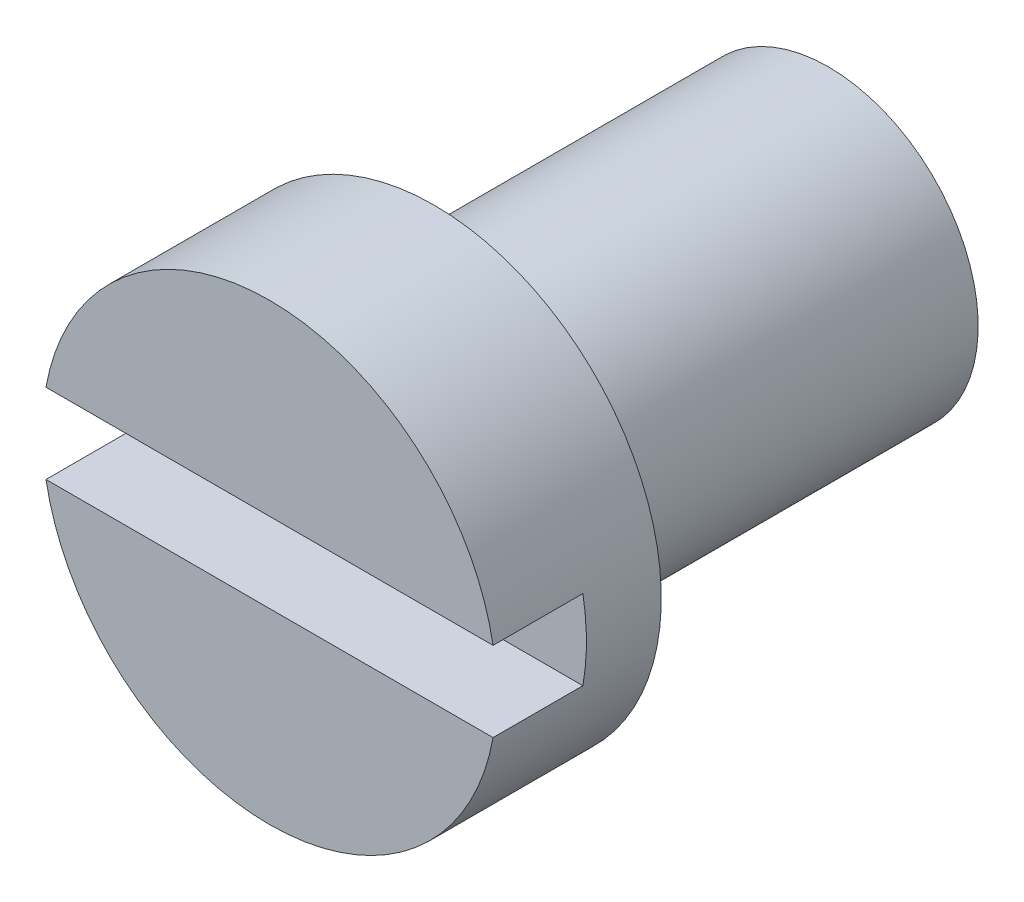
ISO-10303-21;
HEADER;
FILE_DESCRIPTION(('STEP AP214'),'2;1');
FILE_NAME('part.step','',(''),(''),'','','');
FILE_SCHEMA(('AUTOMOTIVE_DESIGN { 1 0 10303 214 1 1 1 1 }'));
ENDSEC;
DATA;
#1=APPLICATION_CONTEXT('core data for automotive mechanical design processes');
#2=APPLICATION_PROTOCOL_DEFINITION('international standard','automotive_design',2000,#1);
#3=PRODUCT_CONTEXT('',#1,'mechanical');
#4=PRODUCT('Part','Part','',(#3));
#5=PRODUCT_RELATED_PRODUCT_CATEGORY('part','',(#4));
#6=PRODUCT_DEFINITION_FORMATION('','',#4);
#7=PRODUCT_DEFINITION_CONTEXT('part definition',#1,'design');
#8=PRODUCT_DEFINITION('design','',#6,#7);
#9=PRODUCT_DEFINITION_SHAPE('','',#8);
#10=(LENGTH_UNIT() NAMED_UNIT(*) SI_UNIT(.MILLI.,.METRE.));
#11=(NAMED_UNIT(*) PLANE_ANGLE_UNIT() SI_UNIT($,.RADIAN.));
#12=(NAMED_UNIT(*) SI_UNIT($,.STERADIAN.) SOLID_ANGLE_UNIT());
#13=UNCERTAINTY_MEASURE_WITH_UNIT(LENGTH_MEASURE(1.E-05),#10,'distance_accuracy_value','');
#14=(GEOMETRIC_REPRESENTATION_CONTEXT(3) GLOBAL_UNCERTAINTY_ASSIGNED_CONTEXT((#13)) GLOBAL_UNIT_ASSIGNED_CONTEXT((#10,
#11,#12)) REPRESENTATION_CONTEXT('',''));
#15=CARTESIAN_POINT('',(0.,0.,0.));
#16=DIRECTION('',(0.,0.,1.));
#17=DIRECTION('',(1.,0.,0.));
#18=AXIS2_PLACEMENT_3D('',#15,#16,#17);
#19=CARTESIAN_POINT('',(0.,0.,0.));
#20=DIRECTION('',(0.,0.,1.));
#21=DIRECTION('',(0.,-1.,0.));
#22=AXIS2_PLACEMENT_3D('',#19,#20,#21);
#23=PLANE('',#22);
#24=DIRECTION('',(-1.,0.,0.));
#25=VECTOR('',#24,1.);
#26=CARTESIAN_POINT('',(-5.8082123979457,0.8,0.));
#27=LINE('',#26,#25);
#28=CARTESIAN_POINT('',(4.47911821679223,0.8,0.));
#29=VERTEX_POINT('',#28);
#30=CARTESIAN_POINT('',(-4.47911821679223,0.8,0.));
#31=VERTEX_POINT('',#30);
#32=EDGE_CURVE('E81',#29,#31,#27,.T.);
#33=ORIENTED_EDGE('',*,*,#32,.F.);
#34=CARTESIAN_POINT('',(0.,0.,0.));
#35=DIRECTION('',(0.,0.,-1.));
#36=DIRECTION('',(0.,1.,0.));
#37=AXIS2_PLACEMENT_3D('',#34,#35,#36);
#38=CIRCLE('',#37,4.55);
#39=EDGE_CURVE('E89',#31,#29,#38,.T.);
#40=ORIENTED_EDGE('',*,*,#39,.F.);
#41=EDGE_LOOP('',(#33,#40));
#42=FACE_BOUND('',#41,.T.);
#43=ADVANCED_FACE('F34',(#42),#23,.T.);
#44=DIRECTION('',(1.,0.,0.));
#45=VECTOR('',#44,1.);
#46=CARTESIAN_POINT('',(-5.8082123979457,-0.8,0.));
#47=LINE('',#46,#45);
#48=CARTESIAN_POINT('',(-4.47911821679223,-0.8,0.));
#49=VERTEX_POINT('',#48);
#50=CARTESIAN_POINT('',(4.47911821679223,-0.8,0.));
#51=VERTEX_POINT('',#50);
#52=EDGE_CURVE('E74',#49,#51,#47,.T.);
#53=ORIENTED_EDGE('',*,*,#52,.F.);
#54=EDGE_CURVE('E80',#51,#49,#38,.T.);
#55=ORIENTED_EDGE('',*,*,#54,.F.);
#56=EDGE_LOOP('',(#53,#55));
#57=FACE_BOUND('',#56,.T.);
#58=ADVANCED_FACE('F36',(#57),#23,.T.);
#59=CARTESIAN_POINT('',(0.,0.,-11.2));
#60=DIRECTION('',(0.,0.,-1.));
#61=DIRECTION('',(0.,1.,0.));
#62=AXIS2_PLACEMENT_3D('',#59,#60,#61);
#63=CYLINDRICAL_SURFACE('',#62,4.55);
#64=DIRECTION('',(0.,0.,-1.));
#65=VECTOR('',#64,1.);
#66=CARTESIAN_POINT('',(-4.47911821679223,0.8,-11.2));
#67=LINE('',#66,#65);
#68=CARTESIAN_POINT('',(-4.47911821679223,0.8,-1.8));
#69=VERTEX_POINT('',#68);
#70=EDGE_CURVE('E11',#31,#69,#67,.T.);
#71=ORIENTED_EDGE('',*,*,#70,.F.);
#72=ORIENTED_EDGE('',*,*,#39,.T.);
#73=DIRECTION('',(0.,0.,-1.));
#74=VECTOR('',#73,1.);
#75=CARTESIAN_POINT('',(4.47911821679223,0.8,-11.2));
#76=LINE('',#75,#74);
#77=CARTESIAN_POINT('',(4.47911821679223,0.8,-1.8));
#78=VERTEX_POINT('',#77);
#79=EDGE_CURVE('E98',#78,#29,#76,.F.);
#80=ORIENTED_EDGE('',*,*,#79,.F.);
#81=CARTESIAN_POINT('',(0.,0.,-1.8));
#82=DIRECTION('',(0.,0.,1.));
#83=DIRECTION('',(1.,0.,0.));
#84=AXIS2_PLACEMENT_3D('',#81,#82,#83);
#85=CIRCLE('',#84,4.55);
#86=CARTESIAN_POINT('',(4.47911821679223,-0.8,-1.8));
#87=VERTEX_POINT('',#86);
#88=EDGE_CURVE('E88',#78,#87,#85,.F.);
#89=ORIENTED_EDGE('',*,*,#88,.T.);
#90=DIRECTION('',(0.,0.,-1.));
#91=VECTOR('',#90,1.);
#92=CARTESIAN_POINT('',(4.47911821679223,-0.8,-11.2));
#93=LINE('',#92,#91);
#94=EDGE_CURVE('E87',#51,#87,#93,.T.);
#95=ORIENTED_EDGE('',*,*,#94,.F.);
#96=ORIENTED_EDGE('',*,*,#54,.T.);
#97=DIRECTION('',(0.,0.,-1.));
#98=VECTOR('',#97,1.);
#99=CARTESIAN_POINT('',(-4.47911821679223,-0.8,-11.2));
#100=LINE('',#99,#98);
#101=CARTESIAN_POINT('',(-4.47911821679223,-0.8,-1.8));
#102=VERTEX_POINT('',#101);
#103=EDGE_CURVE('E42',#102,#49,#100,.F.);
#104=ORIENTED_EDGE('',*,*,#103,.F.);
#105=EDGE_CURVE('E54',#102,#69,#85,.F.);
#106=ORIENTED_EDGE('',*,*,#105,.T.);
#107=EDGE_LOOP('',(#71,#72,#80,#89,#95,#96,#104,#106));
#108=FACE_BOUND('',#107,.T.);
#109=CARTESIAN_POINT('',(0.,0.,-3.3));
#110=DIRECTION('',(0.,0.,-1.));
#111=DIRECTION('',(0.,1.,0.));
#112=AXIS2_PLACEMENT_3D('',#109,#110,#111);
#113=CIRCLE('',#112,4.55);
#114=CARTESIAN_POINT('',(0.,4.55,-3.3));
#115=VERTEX_POINT('',#114);
#116=EDGE_CURVE('E93',#115,#115,#113,.T.);
#117=ORIENTED_EDGE('',*,*,#116,.F.);
#118=EDGE_LOOP('',(#117));
#119=FACE_BOUND('',#118,.T.);
#120=ADVANCED_FACE('F84',(#108,#119),#63,.T.);
#121=CARTESIAN_POINT('',(0.,4.55,-3.3));
#122=DIRECTION('',(0.,0.,-1.));
#123=DIRECTION('',(0.,1.,0.));
#124=AXIS2_PLACEMENT_3D('',#121,#122,#123);
#125=PLANE('',#124);
#126=ORIENTED_EDGE('',*,*,#116,.T.);
#127=EDGE_LOOP('',(#126));
#128=FACE_BOUND('',#127,.T.);
#129=CARTESIAN_POINT('',(0.,0.,-3.3));
#130=DIRECTION('',(0.,0.,-1.));
#131=DIRECTION('',(0.,1.,0.));
#132=AXIS2_PLACEMENT_3D('',#129,#130,#131);
#133=CIRCLE('',#132,3.);
#134=CARTESIAN_POINT('',(0.,3.,-3.3));
#135=VERTEX_POINT('',#134);
#136=EDGE_CURVE('E112',#135,#135,#133,.T.);
#137=ORIENTED_EDGE('',*,*,#136,.F.);
#138=EDGE_LOOP('',(#137));
#139=FACE_BOUND('',#138,.T.);
#140=ADVANCED_FACE('F119',(#128,#139),#125,.T.);
#141=CARTESIAN_POINT('',(0.,0.,-11.2));
#142=DIRECTION('',(0.,0.,-1.));
#143=DIRECTION('',(0.,1.,0.));
#144=AXIS2_PLACEMENT_3D('',#141,#142,#143);
#145=CYLINDRICAL_SURFACE('',#144,3.);
#146=ORIENTED_EDGE('',*,*,#136,.T.);
#147=EDGE_LOOP('',(#146));
#148=FACE_BOUND('',#147,.T.);
#149=CARTESIAN_POINT('',(0.,0.,-11.2));
#150=DIRECTION('',(0.,0.,-1.));
#151=DIRECTION('',(0.,1.,0.));
#152=AXIS2_PLACEMENT_3D('',#149,#150,#151);
#153=CIRCLE('',#152,3.);
#154=CARTESIAN_POINT('',(0.,3.,-11.2));
#155=VERTEX_POINT('',#154);
#156=EDGE_CURVE('E110',#155,#155,#153,.T.);
#157=ORIENTED_EDGE('',*,*,#156,.F.);
#158=EDGE_LOOP('',(#157));
#159=FACE_BOUND('',#158,.T.);
#160=ADVANCED_FACE('F126',(#148,#159),#145,.T.);
#161=CARTESIAN_POINT('',(0.,3.,-11.2));
#162=DIRECTION('',(0.,0.,-1.));
#163=DIRECTION('',(0.,1.,0.));
#164=AXIS2_PLACEMENT_3D('',#161,#162,#163);
#165=PLANE('',#164);
#166=ORIENTED_EDGE('',*,*,#156,.T.);
#167=EDGE_LOOP('',(#166));
#168=FACE_BOUND('',#167,.T.);
#169=ADVANCED_FACE('F153',(#168),#165,.T.);
#170=CARTESIAN_POINT('',(-5.8082123979457,0.8,-1.8));
#171=DIRECTION('',(0.,1.,0.));
#172=DIRECTION('',(0.,0.,1.));
#173=AXIS2_PLACEMENT_3D('',#170,#171,#172);
#174=PLANE('',#173);
#175=ORIENTED_EDGE('',*,*,#79,.T.);
#176=ORIENTED_EDGE('',*,*,#32,.T.);
#177=ORIENTED_EDGE('',*,*,#70,.T.);
#178=DIRECTION('',(-1.,0.,0.));
#179=VECTOR('',#178,1.);
#180=CARTESIAN_POINT('',(-5.8082123979457,0.8,-1.8));
#181=LINE('',#180,#179);
#182=EDGE_CURVE('E106',#78,#69,#181,.T.);
#183=ORIENTED_EDGE('',*,*,#182,.F.);
#184=EDGE_LOOP('',(#175,#176,#177,#183));
#185=FACE_BOUND('',#184,.T.);
#186=ADVANCED_FACE('F148',(#185),#174,.F.);
#187=CARTESIAN_POINT('',(-5.8082123979457,-0.8,-1.8));
#188=DIRECTION('',(0.,-1.,0.));
#189=DIRECTION('',(0.,0.,-1.));
#190=AXIS2_PLACEMENT_3D('',#187,#188,#189);
#191=PLANE('',#190);
#192=ORIENTED_EDGE('',*,*,#103,.T.);
#193=ORIENTED_EDGE('',*,*,#52,.T.);
#194=ORIENTED_EDGE('',*,*,#94,.T.);
#195=DIRECTION('',(1.,0.,0.));
#196=VECTOR('',#195,1.);
#197=CARTESIAN_POINT('',(-5.8082123979457,-0.8,-1.8));
#198=LINE('',#197,#196);
#199=EDGE_CURVE('E49',#102,#87,#198,.T.);
#200=ORIENTED_EDGE('',*,*,#199,.F.);
#201=EDGE_LOOP('',(#192,#193,#194,#200));
#202=FACE_BOUND('',#201,.T.);
#203=ADVANCED_FACE('F73',(#202),#191,.F.);
#204=CARTESIAN_POINT('',(0.,0.,-1.8));
#205=DIRECTION('',(0.,0.,1.));
#206=DIRECTION('',(1.,0.,0.));
#207=AXIS2_PLACEMENT_3D('',#204,#205,#206);
#208=PLANE('',#207);
#209=ORIENTED_EDGE('',*,*,#199,.T.);
#210=ORIENTED_EDGE('',*,*,#88,.F.);
#211=ORIENTED_EDGE('',*,*,#182,.T.);
#212=ORIENTED_EDGE('',*,*,#105,.F.);
#213=EDGE_LOOP('',(#209,#210,#211,#212));
#214=FACE_BOUND('',#213,.T.);
#215=ADVANCED_FACE('F163',(#214),#208,.T.);
#216=CLOSED_SHELL('',(#43,#58,#120,#140,#160,#169,#186,#203,#215));
#217=MANIFOLD_SOLID_BREP('B2',#216);
#218=ADVANCED_BREP_SHAPE_REPRESENTATION('',(#18,#217),#14);
#219=SHAPE_DEFINITION_REPRESENTATION(#9,#218);
ENDSEC;
END-ISO-10303-21;
